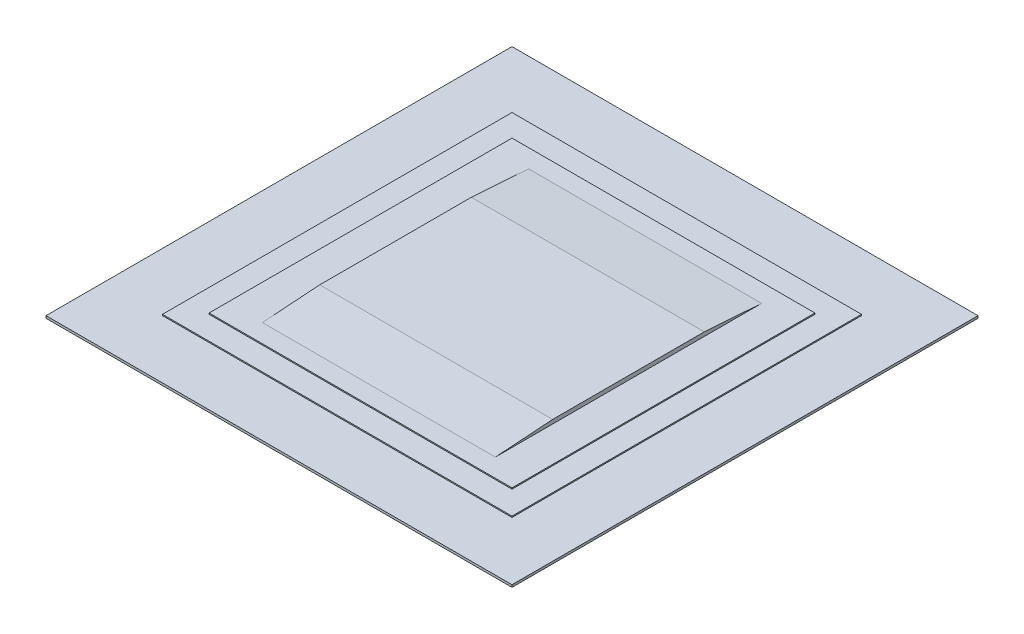
ISO-10303-21;
HEADER;
FILE_DESCRIPTION(('STEP AP214'),'2;1');
FILE_NAME('part.step','',(''),(''),'','','');
FILE_SCHEMA(('AUTOMOTIVE_DESIGN { 1 0 10303 214 1 1 1 1 }'));
ENDSEC;
DATA;
#1=APPLICATION_CONTEXT('core data for automotive mechanical design processes');
#2=APPLICATION_PROTOCOL_DEFINITION('international standard','automotive_design',2000,#1);
#3=PRODUCT_CONTEXT('',#1,'mechanical');
#4=PRODUCT('Part','Part','',(#3));
#5=PRODUCT_RELATED_PRODUCT_CATEGORY('part','',(#4));
#6=PRODUCT_DEFINITION_FORMATION('','',#4);
#7=PRODUCT_DEFINITION_CONTEXT('part definition',#1,'design');
#8=PRODUCT_DEFINITION('design','',#6,#7);
#9=PRODUCT_DEFINITION_SHAPE('','',#8);
#10=(LENGTH_UNIT() NAMED_UNIT(*) SI_UNIT(.MILLI.,.METRE.));
#11=(NAMED_UNIT(*) PLANE_ANGLE_UNIT() SI_UNIT($,.RADIAN.));
#12=(NAMED_UNIT(*) SI_UNIT($,.STERADIAN.) SOLID_ANGLE_UNIT());
#13=UNCERTAINTY_MEASURE_WITH_UNIT(LENGTH_MEASURE(1.E-05),#10,'distance_accuracy_value','');
#14=(GEOMETRIC_REPRESENTATION_CONTEXT(3) GLOBAL_UNCERTAINTY_ASSIGNED_CONTEXT((#13)) GLOBAL_UNIT_ASSIGNED_CONTEXT((#10,
#11,#12)) REPRESENTATION_CONTEXT('',''));
#15=CARTESIAN_POINT('',(0.,0.,0.));
#16=DIRECTION('',(0.,0.,1.));
#17=DIRECTION('',(1.,0.,0.));
#18=AXIS2_PLACEMENT_3D('',#15,#16,#17);
#19=CARTESIAN_POINT('',(0.,20.,0.));
#20=DIRECTION('',(0.,1.,0.));
#21=DIRECTION('',(0.,0.,1.));
#22=AXIS2_PLACEMENT_3D('',#19,#20,#21);
#23=PLANE('',#22);
#24=DIRECTION('',(0.,0.,-1.));
#25=VECTOR('',#24,1.);
#26=CARTESIAN_POINT('',(650.,20.,-650.));
#27=LINE('',#26,#25);
#28=CARTESIAN_POINT('',(650.,20.,650.));
#29=VERTEX_POINT('',#28);
#30=CARTESIAN_POINT('',(650.,20.,-650.));
#31=VERTEX_POINT('',#30);
#32=EDGE_CURVE('E191',#29,#31,#27,.T.);
#33=ORIENTED_EDGE('',*,*,#32,.T.);
#34=DIRECTION('',(-1.,0.,0.));
#35=VECTOR('',#34,1.);
#36=CARTESIAN_POINT('',(-650.,20.,-650.));
#37=LINE('',#36,#35);
#38=CARTESIAN_POINT('',(-650.,20.,-650.));
#39=VERTEX_POINT('',#38);
#40=EDGE_CURVE('E195',#31,#39,#37,.T.);
#41=ORIENTED_EDGE('',*,*,#40,.T.);
#42=DIRECTION('',(0.,0.,1.));
#43=VECTOR('',#42,1.);
#44=CARTESIAN_POINT('',(-650.,20.,-650.));
#45=LINE('',#44,#43);
#46=CARTESIAN_POINT('',(-650.,20.,650.));
#47=VERTEX_POINT('',#46);
#48=EDGE_CURVE('E199',#39,#47,#45,.T.);
#49=ORIENTED_EDGE('',*,*,#48,.T.);
#50=DIRECTION('',(1.,0.,0.));
#51=VECTOR('',#50,1.);
#52=CARTESIAN_POINT('',(-650.,20.,650.));
#53=LINE('',#52,#51);
#54=EDGE_CURVE('E202',#47,#29,#53,.T.);
#55=ORIENTED_EDGE('',*,*,#54,.T.);
#56=EDGE_LOOP('',(#33,#41,#49,#55));
#57=FACE_BOUND('',#56,.T.);
#58=DIRECTION('',(-1.,0.,0.));
#59=VECTOR('',#58,1.);
#60=CARTESIAN_POINT('',(500.,20.,571.371380233895));
#61=LINE('',#60,#59);
#62=CARTESIAN_POINT('',(500.,20.,571.371380233895));
#63=VERTEX_POINT('',#62);
#64=CARTESIAN_POINT('',(-500.,20.,571.371380233895));
#65=VERTEX_POINT('',#64);
#66=EDGE_CURVE('E564',#63,#65,#61,.T.);
#67=ORIENTED_EDGE('',*,*,#66,.T.);
#68=DIRECTION('',(0.,0.,-1.));
#69=VECTOR('',#68,1.);
#70=CARTESIAN_POINT('',(-500.,20.,571.371380233895));
#71=LINE('',#70,#69);
#72=CARTESIAN_POINT('',(-500.,20.,-571.371380233895));
#73=VERTEX_POINT('',#72);
#74=EDGE_CURVE('E59',#65,#73,#71,.T.);
#75=ORIENTED_EDGE('',*,*,#74,.T.);
#76=DIRECTION('',(-1.,0.,0.));
#77=VECTOR('',#76,1.);
#78=CARTESIAN_POINT('',(500.,20.,-571.371380233895));
#79=LINE('',#78,#77);
#80=CARTESIAN_POINT('',(500.,20.,-571.371380233895));
#81=VERTEX_POINT('',#80);
#82=EDGE_CURVE('E162',#81,#73,#79,.T.);
#83=ORIENTED_EDGE('',*,*,#82,.F.);
#84=DIRECTION('',(0.,0.,-1.));
#85=VECTOR('',#84,1.);
#86=CARTESIAN_POINT('',(500.,20.,571.371380233895));
#87=LINE('',#86,#85);
#88=EDGE_CURVE('E169',#63,#81,#87,.T.);
#89=ORIENTED_EDGE('',*,*,#88,.F.);
#90=EDGE_LOOP('',(#67,#75,#83,#89));
#91=FACE_BOUND('',#90,.T.);
#92=ADVANCED_FACE('F43',(#57,#91),#23,.T.);
#93=CARTESIAN_POINT('',(1000.,10.,-1000.));
#94=DIRECTION('',(-1.,0.,0.));
#95=DIRECTION('',(0.,0.,1.));
#96=AXIS2_PLACEMENT_3D('',#93,#94,#95);
#97=PLANE('',#96);
#98=DIRECTION('',(0.,0.,-1.));
#99=VECTOR('',#98,1.);
#100=CARTESIAN_POINT('',(1000.,0.,-1000.));
#101=LINE('',#100,#99);
#102=CARTESIAN_POINT('',(1000.,0.,1000.));
#103=VERTEX_POINT('',#102);
#104=CARTESIAN_POINT('',(1000.,0.,-1000.));
#105=VERTEX_POINT('',#104);
#106=EDGE_CURVE('E275',#103,#105,#101,.T.);
#107=ORIENTED_EDGE('',*,*,#106,.T.);
#108=DIRECTION('',(0.,-1.,0.));
#109=VECTOR('',#108,1.);
#110=CARTESIAN_POINT('',(1000.,10.,-1000.));
#111=LINE('',#110,#109);
#112=CARTESIAN_POINT('',(1000.,10.,-1000.));
#113=VERTEX_POINT('',#112);
#114=EDGE_CURVE('E11',#113,#105,#111,.T.);
#115=ORIENTED_EDGE('',*,*,#114,.F.);
#116=DIRECTION('',(0.,0.,-1.));
#117=VECTOR('',#116,1.);
#118=CARTESIAN_POINT('',(1000.,10.,-1000.));
#119=LINE('',#118,#117);
#120=CARTESIAN_POINT('',(1000.,10.,1000.));
#121=VERTEX_POINT('',#120);
#122=EDGE_CURVE('E276',#121,#113,#119,.T.);
#123=ORIENTED_EDGE('',*,*,#122,.F.);
#124=DIRECTION('',(0.,-1.,0.));
#125=VECTOR('',#124,1.);
#126=CARTESIAN_POINT('',(1000.,10.,1000.));
#127=LINE('',#126,#125);
#128=EDGE_CURVE('E290',#121,#103,#127,.T.);
#129=ORIENTED_EDGE('',*,*,#128,.T.);
#130=EDGE_LOOP('',(#107,#115,#123,#129));
#131=FACE_BOUND('',#130,.T.);
#132=ADVANCED_FACE('F45',(#131),#97,.F.);
#133=CARTESIAN_POINT('',(-1000.,10.,-1000.));
#134=DIRECTION('',(0.,0.,1.));
#135=DIRECTION('',(1.,0.,0.));
#136=AXIS2_PLACEMENT_3D('',#133,#134,#135);
#137=PLANE('',#136);
#138=DIRECTION('',(-1.,0.,0.));
#139=VECTOR('',#138,1.);
#140=CARTESIAN_POINT('',(-1000.,0.,-1000.));
#141=LINE('',#140,#139);
#142=CARTESIAN_POINT('',(-1000.,0.,-1000.));
#143=VERTEX_POINT('',#142);
#144=EDGE_CURVE('E294',#105,#143,#141,.T.);
#145=ORIENTED_EDGE('',*,*,#144,.T.);
#146=DIRECTION('',(0.,-1.,0.));
#147=VECTOR('',#146,1.);
#148=CARTESIAN_POINT('',(-1000.,10.,-1000.));
#149=LINE('',#148,#147);
#150=CARTESIAN_POINT('',(-1000.,10.,-1000.));
#151=VERTEX_POINT('',#150);
#152=EDGE_CURVE('E52',#151,#143,#149,.T.);
#153=ORIENTED_EDGE('',*,*,#152,.F.);
#154=DIRECTION('',(-1.,0.,0.));
#155=VECTOR('',#154,1.);
#156=CARTESIAN_POINT('',(-1000.,10.,-1000.));
#157=LINE('',#156,#155);
#158=EDGE_CURVE('E280',#113,#151,#157,.T.);
#159=ORIENTED_EDGE('',*,*,#158,.F.);
#160=ORIENTED_EDGE('',*,*,#114,.T.);
#161=EDGE_LOOP('',(#145,#153,#159,#160));
#162=FACE_BOUND('',#161,.T.);
#163=ADVANCED_FACE('F330',(#162),#137,.F.);
#164=CARTESIAN_POINT('',(-1000.,10.,-1000.));
#165=DIRECTION('',(1.,0.,0.));
#166=DIRECTION('',(0.,0.,-1.));
#167=AXIS2_PLACEMENT_3D('',#164,#165,#166);
#168=PLANE('',#167);
#169=DIRECTION('',(0.,0.,1.));
#170=VECTOR('',#169,1.);
#171=CARTESIAN_POINT('',(-1000.,0.,-1000.));
#172=LINE('',#171,#170);
#173=CARTESIAN_POINT('',(-1000.,0.,1000.));
#174=VERTEX_POINT('',#173);
#175=EDGE_CURVE('E297',#143,#174,#172,.T.);
#176=ORIENTED_EDGE('',*,*,#175,.T.);
#177=DIRECTION('',(0.,-1.,0.));
#178=VECTOR('',#177,1.);
#179=CARTESIAN_POINT('',(-1000.,10.,1000.));
#180=LINE('',#179,#178);
#181=CARTESIAN_POINT('',(-1000.,10.,1000.));
#182=VERTEX_POINT('',#181);
#183=EDGE_CURVE('E305',#182,#174,#180,.T.);
#184=ORIENTED_EDGE('',*,*,#183,.F.);
#185=DIRECTION('',(0.,0.,1.));
#186=VECTOR('',#185,1.);
#187=CARTESIAN_POINT('',(-1000.,10.,-1000.));
#188=LINE('',#187,#186);
#189=EDGE_CURVE('E284',#151,#182,#188,.T.);
#190=ORIENTED_EDGE('',*,*,#189,.F.);
#191=ORIENTED_EDGE('',*,*,#152,.T.);
#192=EDGE_LOOP('',(#176,#184,#190,#191));
#193=FACE_BOUND('',#192,.T.);
#194=ADVANCED_FACE('F314',(#193),#168,.F.);
#195=CARTESIAN_POINT('',(-1000.,10.,1000.));
#196=DIRECTION('',(0.,0.,-1.));
#197=DIRECTION('',(-1.,0.,0.));
#198=AXIS2_PLACEMENT_3D('',#195,#196,#197);
#199=PLANE('',#198);
#200=DIRECTION('',(1.,0.,0.));
#201=VECTOR('',#200,1.);
#202=CARTESIAN_POINT('',(-1000.,0.,1000.));
#203=LINE('',#202,#201);
#204=EDGE_CURVE('E281',#174,#103,#203,.T.);
#205=ORIENTED_EDGE('',*,*,#204,.T.);
#206=ORIENTED_EDGE('',*,*,#128,.F.);
#207=DIRECTION('',(1.,0.,0.));
#208=VECTOR('',#207,1.);
#209=CARTESIAN_POINT('',(-1000.,10.,1000.));
#210=LINE('',#209,#208);
#211=EDGE_CURVE('E287',#182,#121,#210,.T.);
#212=ORIENTED_EDGE('',*,*,#211,.F.);
#213=ORIENTED_EDGE('',*,*,#183,.T.);
#214=EDGE_LOOP('',(#205,#206,#212,#213));
#215=FACE_BOUND('',#214,.T.);
#216=ADVANCED_FACE('F323',(#215),#199,.F.);
#217=CARTESIAN_POINT('',(0.,10.,0.));
#218=DIRECTION('',(0.,1.,0.));
#219=DIRECTION('',(0.,0.,1.));
#220=AXIS2_PLACEMENT_3D('',#217,#218,#219);
#221=PLANE('',#220);
#222=DIRECTION('',(0.,0.,-1.));
#223=VECTOR('',#222,1.);
#224=CARTESIAN_POINT('',(750.,10.,-750.));
#225=LINE('',#224,#223);
#226=CARTESIAN_POINT('',(750.,10.,750.));
#227=VERTEX_POINT('',#226);
#228=CARTESIAN_POINT('',(750.,10.,-750.));
#229=VERTEX_POINT('',#228);
#230=EDGE_CURVE('E230',#227,#229,#225,.T.);
#231=ORIENTED_EDGE('',*,*,#230,.F.);
#232=DIRECTION('',(1.,0.,0.));
#233=VECTOR('',#232,1.);
#234=CARTESIAN_POINT('',(-750.,10.,750.));
#235=LINE('',#234,#233);
#236=CARTESIAN_POINT('',(-750.,10.,750.));
#237=VERTEX_POINT('',#236);
#238=EDGE_CURVE('E236',#237,#227,#235,.T.);
#239=ORIENTED_EDGE('',*,*,#238,.F.);
#240=DIRECTION('',(0.,0.,1.));
#241=VECTOR('',#240,1.);
#242=CARTESIAN_POINT('',(-750.,10.,-750.));
#243=LINE('',#242,#241);
#244=CARTESIAN_POINT('',(-750.,10.,-750.));
#245=VERTEX_POINT('',#244);
#246=EDGE_CURVE('E253',#245,#237,#243,.T.);
#247=ORIENTED_EDGE('',*,*,#246,.F.);
#248=DIRECTION('',(-1.,0.,0.));
#249=VECTOR('',#248,1.);
#250=CARTESIAN_POINT('',(-750.,10.,-750.));
#251=LINE('',#250,#249);
#252=EDGE_CURVE('E249',#229,#245,#251,.T.);
#253=ORIENTED_EDGE('',*,*,#252,.F.);
#254=EDGE_LOOP('',(#231,#239,#247,#253));
#255=FACE_BOUND('',#254,.T.);
#256=ORIENTED_EDGE('',*,*,#122,.T.);
#257=ORIENTED_EDGE('',*,*,#158,.T.);
#258=ORIENTED_EDGE('',*,*,#189,.T.);
#259=ORIENTED_EDGE('',*,*,#211,.T.);
#260=EDGE_LOOP('',(#256,#257,#258,#259));
#261=FACE_BOUND('',#260,.T.);
#262=ADVANCED_FACE('F329',(#255,#261),#221,.T.);
#263=CARTESIAN_POINT('',(0.,0.,0.));
#264=DIRECTION('',(0.,1.,0.));
#265=DIRECTION('',(0.,0.,1.));
#266=AXIS2_PLACEMENT_3D('',#263,#264,#265);
#267=PLANE('',#266);
#268=ORIENTED_EDGE('',*,*,#106,.F.);
#269=ORIENTED_EDGE('',*,*,#204,.F.);
#270=ORIENTED_EDGE('',*,*,#175,.F.);
#271=ORIENTED_EDGE('',*,*,#144,.F.);
#272=EDGE_LOOP('',(#268,#269,#270,#271));
#273=FACE_BOUND('',#272,.T.);
#274=ADVANCED_FACE('F320',(#273),#267,.F.);
#275=CARTESIAN_POINT('',(750.,15.,-750.));
#276=DIRECTION('',(-1.,0.,0.));
#277=DIRECTION('',(0.,0.,1.));
#278=AXIS2_PLACEMENT_3D('',#275,#276,#277);
#279=PLANE('',#278);
#280=ORIENTED_EDGE('',*,*,#230,.T.);
#281=DIRECTION('',(0.,-1.,0.));
#282=VECTOR('',#281,1.);
#283=CARTESIAN_POINT('',(750.,15.,-750.));
#284=LINE('',#283,#282);
#285=CARTESIAN_POINT('',(750.,15.,-750.));
#286=VERTEX_POINT('',#285);
#287=EDGE_CURVE('E271',#286,#229,#284,.T.);
#288=ORIENTED_EDGE('',*,*,#287,.F.);
#289=DIRECTION('',(0.,0.,-1.));
#290=VECTOR('',#289,1.);
#291=CARTESIAN_POINT('',(750.,15.,-750.));
#292=LINE('',#291,#290);
#293=CARTESIAN_POINT('',(750.,15.,750.));
#294=VERTEX_POINT('',#293);
#295=EDGE_CURVE('E231',#294,#286,#292,.T.);
#296=ORIENTED_EDGE('',*,*,#295,.F.);
#297=DIRECTION('',(0.,-1.,0.));
#298=VECTOR('',#297,1.);
#299=CARTESIAN_POINT('',(750.,15.,750.));
#300=LINE('',#299,#298);
#301=EDGE_CURVE('E245',#294,#227,#300,.T.);
#302=ORIENTED_EDGE('',*,*,#301,.T.);
#303=EDGE_LOOP('',(#280,#288,#296,#302));
#304=FACE_BOUND('',#303,.T.);
#305=ADVANCED_FACE('F375',(#304),#279,.F.);
#306=CARTESIAN_POINT('',(-750.,15.,-750.));
#307=DIRECTION('',(0.,0.,1.));
#308=DIRECTION('',(1.,0.,0.));
#309=AXIS2_PLACEMENT_3D('',#306,#307,#308);
#310=PLANE('',#309);
#311=ORIENTED_EDGE('',*,*,#252,.T.);
#312=DIRECTION('',(0.,-1.,0.));
#313=VECTOR('',#312,1.);
#314=CARTESIAN_POINT('',(-750.,15.,-750.));
#315=LINE('',#314,#313);
#316=CARTESIAN_POINT('',(-750.,15.,-750.));
#317=VERTEX_POINT('',#316);
#318=EDGE_CURVE('E267',#317,#245,#315,.T.);
#319=ORIENTED_EDGE('',*,*,#318,.F.);
#320=DIRECTION('',(-1.,0.,0.));
#321=VECTOR('',#320,1.);
#322=CARTESIAN_POINT('',(-750.,15.,-750.));
#323=LINE('',#322,#321);
#324=EDGE_CURVE('E235',#286,#317,#323,.T.);
#325=ORIENTED_EDGE('',*,*,#324,.F.);
#326=ORIENTED_EDGE('',*,*,#287,.T.);
#327=EDGE_LOOP('',(#311,#319,#325,#326));
#328=FACE_BOUND('',#327,.T.);
#329=ADVANCED_FACE('F371',(#328),#310,.F.);
#330=CARTESIAN_POINT('',(-750.,15.,-750.));
#331=DIRECTION('',(1.,0.,0.));
#332=DIRECTION('',(0.,0.,-1.));
#333=AXIS2_PLACEMENT_3D('',#330,#331,#332);
#334=PLANE('',#333);
#335=ORIENTED_EDGE('',*,*,#246,.T.);
#336=DIRECTION('',(0.,-1.,0.));
#337=VECTOR('',#336,1.);
#338=CARTESIAN_POINT('',(-750.,15.,750.));
#339=LINE('',#338,#337);
#340=CARTESIAN_POINT('',(-750.,15.,750.));
#341=VERTEX_POINT('',#340);
#342=EDGE_CURVE('E263',#341,#237,#339,.T.);
#343=ORIENTED_EDGE('',*,*,#342,.F.);
#344=DIRECTION('',(0.,0.,1.));
#345=VECTOR('',#344,1.);
#346=CARTESIAN_POINT('',(-750.,15.,-750.));
#347=LINE('',#346,#345);
#348=EDGE_CURVE('E239',#317,#341,#347,.T.);
#349=ORIENTED_EDGE('',*,*,#348,.F.);
#350=ORIENTED_EDGE('',*,*,#318,.T.);
#351=EDGE_LOOP('',(#335,#343,#349,#350));
#352=FACE_BOUND('',#351,.T.);
#353=ADVANCED_FACE('F367',(#352),#334,.F.);
#354=CARTESIAN_POINT('',(-750.,15.,750.));
#355=DIRECTION('',(0.,0.,-1.));
#356=DIRECTION('',(-1.,0.,0.));
#357=AXIS2_PLACEMENT_3D('',#354,#355,#356);
#358=PLANE('',#357);
#359=ORIENTED_EDGE('',*,*,#238,.T.);
#360=ORIENTED_EDGE('',*,*,#301,.F.);
#361=DIRECTION('',(1.,0.,0.));
#362=VECTOR('',#361,1.);
#363=CARTESIAN_POINT('',(-750.,15.,750.));
#364=LINE('',#363,#362);
#365=EDGE_CURVE('E242',#341,#294,#364,.T.);
#366=ORIENTED_EDGE('',*,*,#365,.F.);
#367=ORIENTED_EDGE('',*,*,#342,.T.);
#368=EDGE_LOOP('',(#359,#360,#366,#367));
#369=FACE_BOUND('',#368,.T.);
#370=ADVANCED_FACE('F364',(#369),#358,.F.);
#371=CARTESIAN_POINT('',(0.,15.,0.));
#372=DIRECTION('',(0.,1.,0.));
#373=DIRECTION('',(0.,0.,1.));
#374=AXIS2_PLACEMENT_3D('',#371,#372,#373);
#375=PLANE('',#374);
#376=DIRECTION('',(0.,0.,-1.));
#377=VECTOR('',#376,1.);
#378=CARTESIAN_POINT('',(650.,15.,-650.));
#379=LINE('',#378,#377);
#380=CARTESIAN_POINT('',(650.,15.,650.));
#381=VERTEX_POINT('',#380);
#382=CARTESIAN_POINT('',(650.,15.,-650.));
#383=VERTEX_POINT('',#382);
#384=EDGE_CURVE('E67',#381,#383,#379,.T.);
#385=ORIENTED_EDGE('',*,*,#384,.F.);
#386=DIRECTION('',(1.,0.,0.));
#387=VECTOR('',#386,1.);
#388=CARTESIAN_POINT('',(-650.,15.,650.));
#389=LINE('',#388,#387);
#390=CARTESIAN_POINT('',(-650.,15.,650.));
#391=VERTEX_POINT('',#390);
#392=EDGE_CURVE('E196',#391,#381,#389,.T.);
#393=ORIENTED_EDGE('',*,*,#392,.F.);
#394=DIRECTION('',(0.,0.,1.));
#395=VECTOR('',#394,1.);
#396=CARTESIAN_POINT('',(-650.,15.,-650.));
#397=LINE('',#396,#395);
#398=CARTESIAN_POINT('',(-650.,15.,-650.));
#399=VERTEX_POINT('',#398);
#400=EDGE_CURVE('E209',#399,#391,#397,.T.);
#401=ORIENTED_EDGE('',*,*,#400,.F.);
#402=DIRECTION('',(-1.,0.,0.));
#403=VECTOR('',#402,1.);
#404=CARTESIAN_POINT('',(-650.,15.,-650.));
#405=LINE('',#404,#403);
#406=EDGE_CURVE('E185',#383,#399,#405,.T.);
#407=ORIENTED_EDGE('',*,*,#406,.F.);
#408=EDGE_LOOP('',(#385,#393,#401,#407));
#409=FACE_BOUND('',#408,.T.);
#410=ORIENTED_EDGE('',*,*,#295,.T.);
#411=ORIENTED_EDGE('',*,*,#324,.T.);
#412=ORIENTED_EDGE('',*,*,#348,.T.);
#413=ORIENTED_EDGE('',*,*,#365,.T.);
#414=EDGE_LOOP('',(#410,#411,#412,#413));
#415=FACE_BOUND('',#414,.T.);
#416=ADVANCED_FACE('F360',(#409,#415),#375,.T.);
#417=CARTESIAN_POINT('',(650.,20.,-650.));
#418=DIRECTION('',(-1.,0.,0.));
#419=DIRECTION('',(0.,0.,1.));
#420=AXIS2_PLACEMENT_3D('',#417,#418,#419);
#421=PLANE('',#420);
#422=ORIENTED_EDGE('',*,*,#384,.T.);
#423=DIRECTION('',(0.,-1.,0.));
#424=VECTOR('',#423,1.);
#425=CARTESIAN_POINT('',(650.,20.,-650.));
#426=LINE('',#425,#424);
#427=EDGE_CURVE('E226',#31,#383,#426,.T.);
#428=ORIENTED_EDGE('',*,*,#427,.F.);
#429=ORIENTED_EDGE('',*,*,#32,.F.);
#430=DIRECTION('',(0.,-1.,0.));
#431=VECTOR('',#430,1.);
#432=CARTESIAN_POINT('',(650.,20.,650.));
#433=LINE('',#432,#431);
#434=EDGE_CURVE('E204',#29,#381,#433,.T.);
#435=ORIENTED_EDGE('',*,*,#434,.T.);
#436=EDGE_LOOP('',(#422,#428,#429,#435));
#437=FACE_BOUND('',#436,.T.);
#438=ADVANCED_FACE('F356',(#437),#421,.F.);
#439=CARTESIAN_POINT('',(-650.,20.,-650.));
#440=DIRECTION('',(0.,0.,1.));
#441=DIRECTION('',(1.,0.,0.));
#442=AXIS2_PLACEMENT_3D('',#439,#440,#441);
#443=PLANE('',#442);
#444=ORIENTED_EDGE('',*,*,#406,.T.);
#445=DIRECTION('',(0.,-1.,0.));
#446=VECTOR('',#445,1.);
#447=CARTESIAN_POINT('',(-650.,20.,-650.));
#448=LINE('',#447,#446);
#449=EDGE_CURVE('E222',#39,#399,#448,.T.);
#450=ORIENTED_EDGE('',*,*,#449,.F.);
#451=ORIENTED_EDGE('',*,*,#40,.F.);
#452=ORIENTED_EDGE('',*,*,#427,.T.);
#453=EDGE_LOOP('',(#444,#450,#451,#452));
#454=FACE_BOUND('',#453,.T.);
#455=ADVANCED_FACE('F352',(#454),#443,.F.);
#456=CARTESIAN_POINT('',(-650.,20.,-650.));
#457=DIRECTION('',(1.,0.,0.));
#458=DIRECTION('',(0.,0.,-1.));
#459=AXIS2_PLACEMENT_3D('',#456,#457,#458);
#460=PLANE('',#459);
#461=ORIENTED_EDGE('',*,*,#400,.T.);
#462=DIRECTION('',(0.,-1.,0.));
#463=VECTOR('',#462,1.);
#464=CARTESIAN_POINT('',(-650.,20.,650.));
#465=LINE('',#464,#463);
#466=EDGE_CURVE('E218',#47,#391,#465,.T.);
#467=ORIENTED_EDGE('',*,*,#466,.F.);
#468=ORIENTED_EDGE('',*,*,#48,.F.);
#469=ORIENTED_EDGE('',*,*,#449,.T.);
#470=EDGE_LOOP('',(#461,#467,#468,#469));
#471=FACE_BOUND('',#470,.T.);
#472=ADVANCED_FACE('F348',(#471),#460,.F.);
#473=CARTESIAN_POINT('',(-650.,20.,650.));
#474=DIRECTION('',(0.,0.,-1.));
#475=DIRECTION('',(-1.,0.,0.));
#476=AXIS2_PLACEMENT_3D('',#473,#474,#475);
#477=PLANE('',#476);
#478=ORIENTED_EDGE('',*,*,#392,.T.);
#479=ORIENTED_EDGE('',*,*,#434,.F.);
#480=ORIENTED_EDGE('',*,*,#54,.F.);
#481=ORIENTED_EDGE('',*,*,#466,.T.);
#482=EDGE_LOOP('',(#478,#479,#480,#481));
#483=FACE_BOUND('',#482,.T.);
#484=ADVANCED_FACE('F345',(#483),#477,.F.);
#485=CARTESIAN_POINT('',(500.,37.1964287851516,-325.450991370104));
#486=DIRECTION('',(0.,-0.997564050259825,0.0697564737441188));
#487=DIRECTION('',(0.,-0.0697564737441188,-0.997564050259825));
#488=AXIS2_PLACEMENT_3D('',#485,#486,#487);
#489=PLANE('',#488);
#490=DIRECTION('',(0.,0.0697564737441188,0.997564050259825));
#491=VECTOR('',#490,1.);
#492=CARTESIAN_POINT('',(-500.,37.1964287851516,-325.450991370104));
#493=LINE('',#492,#491);
#494=CARTESIAN_POINT('',(-500.,37.1964287851516,-325.450991370104));
#495=VERTEX_POINT('',#494);
#496=EDGE_CURVE('E578',#73,#495,#493,.T.);
#497=ORIENTED_EDGE('',*,*,#496,.T.);
#498=DIRECTION('',(-1.,0.,0.));
#499=VECTOR('',#498,1.);
#500=CARTESIAN_POINT('',(500.,37.1964287851516,-325.450991370104));
#501=LINE('',#500,#499);
#502=CARTESIAN_POINT('',(500.,37.1964287851516,-325.450991370104));
#503=VERTEX_POINT('',#502);
#504=EDGE_CURVE('E164',#503,#495,#501,.T.);
#505=ORIENTED_EDGE('',*,*,#504,.F.);
#506=DIRECTION('',(0.,0.0697564737441188,0.997564050259825));
#507=VECTOR('',#506,1.);
#508=CARTESIAN_POINT('',(500.,37.1964287851516,-325.450991370104));
#509=LINE('',#508,#507);
#510=EDGE_CURVE('E158',#81,#503,#509,.T.);
#511=ORIENTED_EDGE('',*,*,#510,.F.);
#512=ORIENTED_EDGE('',*,*,#82,.T.);
#513=EDGE_LOOP('',(#497,#505,#511,#512));
#514=FACE_BOUND('',#513,.T.);
#515=ADVANCED_FACE('F160',(#514),#489,.F.);
#516=CARTESIAN_POINT('',(500.,37.1964287851516,-325.450991370104));
#517=DIRECTION('',(0.,-1.,0.));
#518=DIRECTION('',(0.,0.,-1.));
#519=AXIS2_PLACEMENT_3D('',#516,#517,#518);
#520=PLANE('',#519);
#521=DIRECTION('',(0.,0.,1.));
#522=VECTOR('',#521,1.);
#523=CARTESIAN_POINT('',(-500.,37.1964287851516,-325.450991370104));
#524=LINE('',#523,#522);
#525=CARTESIAN_POINT('',(-500.,37.1964287851515,325.450991370104));
#526=VERTEX_POINT('',#525);
#527=EDGE_CURVE('E568',#495,#526,#524,.T.);
#528=ORIENTED_EDGE('',*,*,#527,.T.);
#529=DIRECTION('',(-1.,0.,0.));
#530=VECTOR('',#529,1.);
#531=CARTESIAN_POINT('',(500.,37.1964287851515,325.450991370104));
#532=LINE('',#531,#530);
#533=CARTESIAN_POINT('',(500.,37.1964287851515,325.450991370104));
#534=VERTEX_POINT('',#533);
#535=EDGE_CURVE('E187',#534,#526,#532,.T.);
#536=ORIENTED_EDGE('',*,*,#535,.F.);
#537=DIRECTION('',(0.,0.,1.));
#538=VECTOR('',#537,1.);
#539=CARTESIAN_POINT('',(500.,37.1964287851516,-325.450991370104));
#540=LINE('',#539,#538);
#541=EDGE_CURVE('E168',#503,#534,#540,.T.);
#542=ORIENTED_EDGE('',*,*,#541,.F.);
#543=ORIENTED_EDGE('',*,*,#504,.T.);
#544=EDGE_LOOP('',(#528,#536,#542,#543));
#545=FACE_BOUND('',#544,.T.);
#546=ADVANCED_FACE('F440',(#545),#520,.F.);
#547=CARTESIAN_POINT('',(500.,37.1964287851515,325.450991370104));
#548=DIRECTION('',(0.,-0.997564050259825,-0.0697564737441184));
#549=DIRECTION('',(0.,0.0697564737441184,-0.997564050259825));
#550=AXIS2_PLACEMENT_3D('',#547,#548,#549);
#551=PLANE('',#550);
#552=DIRECTION('',(0.,-0.0697564737441184,0.997564050259825));
#553=VECTOR('',#552,1.);
#554=CARTESIAN_POINT('',(-500.,37.1964287851515,325.450991370104));
#555=LINE('',#554,#553);
#556=EDGE_CURVE('E179',#526,#65,#555,.T.);
#557=ORIENTED_EDGE('',*,*,#556,.T.);
#558=ORIENTED_EDGE('',*,*,#66,.F.);
#559=DIRECTION('',(0.,-0.0697564737441184,0.997564050259825));
#560=VECTOR('',#559,1.);
#561=CARTESIAN_POINT('',(500.,37.1964287851515,325.450991370104));
#562=LINE('',#561,#560);
#563=EDGE_CURVE('E174',#534,#63,#562,.T.);
#564=ORIENTED_EDGE('',*,*,#563,.F.);
#565=ORIENTED_EDGE('',*,*,#535,.T.);
#566=EDGE_LOOP('',(#557,#558,#564,#565));
#567=FACE_BOUND('',#566,.T.);
#568=ADVANCED_FACE('F446',(#567),#551,.F.);
#569=CARTESIAN_POINT('',(500.,0.,0.));
#570=DIRECTION('',(-1.,0.,0.));
#571=DIRECTION('',(0.,0.,1.));
#572=AXIS2_PLACEMENT_3D('',#569,#570,#571);
#573=PLANE('',#572);
#574=ORIENTED_EDGE('',*,*,#88,.T.);
#575=ORIENTED_EDGE('',*,*,#510,.T.);
#576=ORIENTED_EDGE('',*,*,#541,.T.);
#577=ORIENTED_EDGE('',*,*,#563,.T.);
#578=EDGE_LOOP('',(#574,#575,#576,#577));
#579=FACE_BOUND('',#578,.T.);
#580=ADVANCED_FACE('F172',(#579),#573,.F.);
#581=CARTESIAN_POINT('',(-500.,0.,0.));
#582=DIRECTION('',(-1.,0.,0.));
#583=DIRECTION('',(0.,0.,1.));
#584=AXIS2_PLACEMENT_3D('',#581,#582,#583);
#585=PLANE('',#584);
#586=ORIENTED_EDGE('',*,*,#74,.F.);
#587=ORIENTED_EDGE('',*,*,#556,.F.);
#588=ORIENTED_EDGE('',*,*,#527,.F.);
#589=ORIENTED_EDGE('',*,*,#496,.F.);
#590=EDGE_LOOP('',(#586,#587,#588,#589));
#591=FACE_BOUND('',#590,.T.);
#592=ADVANCED_FACE('F460',(#591),#585,.T.);
#593=CLOSED_SHELL('',(#92,#132,#163,#194,#216,#262,#274,#305,#329,#353,#370,#416,#438,#455,#472,
#484,#515,#546,#568,#580,#592));
#594=MANIFOLD_SOLID_BREP('B2',#593);
#595=ADVANCED_BREP_SHAPE_REPRESENTATION('',(#18,#594),#14);
#596=SHAPE_DEFINITION_REPRESENTATION(#9,#595);
ENDSEC;
END-ISO-10303-21;
